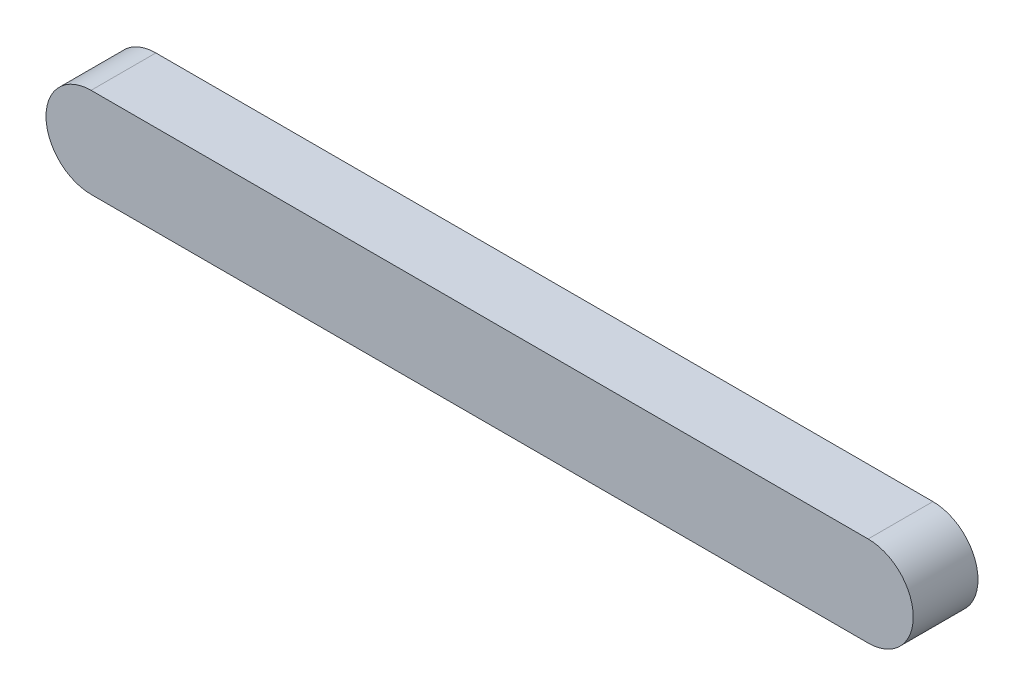
ISO-10303-21;
HEADER;
FILE_DESCRIPTION(('STEP AP214'),'2;1');
FILE_NAME('part.step','',(''),(''),'','','');
FILE_SCHEMA(('AUTOMOTIVE_DESIGN { 1 0 10303 214 1 1 1 1 }'));
ENDSEC;
DATA;
#1=APPLICATION_CONTEXT('core data for automotive mechanical design processes');
#2=APPLICATION_PROTOCOL_DEFINITION('international standard','automotive_design',2000,#1);
#3=PRODUCT_CONTEXT('',#1,'mechanical');
#4=PRODUCT('Part','Part','',(#3));
#5=PRODUCT_RELATED_PRODUCT_CATEGORY('part','',(#4));
#6=PRODUCT_DEFINITION_FORMATION('','',#4);
#7=PRODUCT_DEFINITION_CONTEXT('part definition',#1,'design');
#8=PRODUCT_DEFINITION('design','',#6,#7);
#9=PRODUCT_DEFINITION_SHAPE('','',#8);
#10=(LENGTH_UNIT() NAMED_UNIT(*) SI_UNIT(.MILLI.,.METRE.));
#11=(NAMED_UNIT(*) PLANE_ANGLE_UNIT() SI_UNIT($,.RADIAN.));
#12=(NAMED_UNIT(*) SI_UNIT($,.STERADIAN.) SOLID_ANGLE_UNIT());
#13=UNCERTAINTY_MEASURE_WITH_UNIT(LENGTH_MEASURE(1.E-05),#10,'distance_accuracy_value','');
#14=(GEOMETRIC_REPRESENTATION_CONTEXT(3) GLOBAL_UNCERTAINTY_ASSIGNED_CONTEXT((#13)) GLOBAL_UNIT_ASSIGNED_CONTEXT((#10,
#11,#12)) REPRESENTATION_CONTEXT('',''));
#15=CARTESIAN_POINT('',(0.,0.,0.));
#16=DIRECTION('',(0.,0.,1.));
#17=DIRECTION('',(1.,0.,0.));
#18=AXIS2_PLACEMENT_3D('',#15,#16,#17);
#19=CARTESIAN_POINT('',(0.,0.,10.));
#20=DIRECTION('',(0.,0.,-1.));
#21=DIRECTION('',(-1.,0.,0.));
#22=AXIS2_PLACEMENT_3D('',#19,#20,#21);
#23=CYLINDRICAL_SURFACE('',#22,6.96277578196803);
#24=CARTESIAN_POINT('',(0.,0.,0.));
#25=DIRECTION('',(0.,0.,1.));
#26=DIRECTION('',(1.,0.,0.));
#27=AXIS2_PLACEMENT_3D('',#24,#25,#26);
#28=CIRCLE('',#27,6.96277578196803);
#29=CARTESIAN_POINT('',(0.,6.96277578196803,0.));
#30=VERTEX_POINT('',#29);
#31=CARTESIAN_POINT('',(0.,-6.96277578196803,0.));
#32=VERTEX_POINT('',#31);
#33=EDGE_CURVE('E104',#30,#32,#28,.T.);
#34=ORIENTED_EDGE('',*,*,#33,.T.);
#35=DIRECTION('',(0.,0.,-1.));
#36=VECTOR('',#35,1.);
#37=CARTESIAN_POINT('',(0.,-6.96277578196803,10.));
#38=LINE('',#37,#36);
#39=CARTESIAN_POINT('',(0.,-6.96277578196803,10.));
#40=VERTEX_POINT('',#39);
#41=EDGE_CURVE('E11',#40,#32,#38,.T.);
#42=ORIENTED_EDGE('',*,*,#41,.F.);
#43=CARTESIAN_POINT('',(0.,0.,10.));
#44=DIRECTION('',(0.,0.,1.));
#45=DIRECTION('',(1.,0.,0.));
#46=AXIS2_PLACEMENT_3D('',#43,#44,#45);
#47=CIRCLE('',#46,6.96277578196803);
#48=CARTESIAN_POINT('',(0.,6.96277578196803,10.));
#49=VERTEX_POINT('',#48);
#50=EDGE_CURVE('E92',#49,#40,#47,.T.);
#51=ORIENTED_EDGE('',*,*,#50,.F.);
#52=DIRECTION('',(0.,0.,-1.));
#53=VECTOR('',#52,1.);
#54=CARTESIAN_POINT('',(0.,6.96277578196803,10.));
#55=LINE('',#54,#53);
#56=EDGE_CURVE('E100',#49,#30,#55,.T.);
#57=ORIENTED_EDGE('',*,*,#56,.T.);
#58=EDGE_LOOP('',(#34,#42,#51,#57));
#59=FACE_BOUND('',#58,.T.);
#60=ADVANCED_FACE('F41',(#59),#23,.T.);
#61=CARTESIAN_POINT('',(0.,-6.96277578196803,10.));
#62=DIRECTION('',(0.,1.,0.));
#63=DIRECTION('',(-1.,0.,0.));
#64=AXIS2_PLACEMENT_3D('',#61,#62,#63);
#65=PLANE('',#64);
#66=DIRECTION('',(1.,0.,0.));
#67=VECTOR('',#66,1.);
#68=CARTESIAN_POINT('',(0.,-6.96277578196803,0.));
#69=LINE('',#68,#67);
#70=CARTESIAN_POINT('',(120.,-6.96277578196804,0.));
#71=VERTEX_POINT('',#70);
#72=EDGE_CURVE('E96',#32,#71,#69,.T.);
#73=ORIENTED_EDGE('',*,*,#72,.T.);
#74=DIRECTION('',(0.,0.,-1.));
#75=VECTOR('',#74,1.);
#76=CARTESIAN_POINT('',(120.,-6.96277578196804,10.));
#77=LINE('',#76,#75);
#78=CARTESIAN_POINT('',(120.,-6.96277578196804,10.));
#79=VERTEX_POINT('',#78);
#80=EDGE_CURVE('E49',#79,#71,#77,.T.);
#81=ORIENTED_EDGE('',*,*,#80,.F.);
#82=DIRECTION('',(1.,0.,0.));
#83=VECTOR('',#82,1.);
#84=CARTESIAN_POINT('',(0.,-6.96277578196803,10.));
#85=LINE('',#84,#83);
#86=EDGE_CURVE('E87',#40,#79,#85,.T.);
#87=ORIENTED_EDGE('',*,*,#86,.F.);
#88=ORIENTED_EDGE('',*,*,#41,.T.);
#89=EDGE_LOOP('',(#73,#81,#87,#88));
#90=FACE_BOUND('',#89,.T.);
#91=ADVANCED_FACE('F95',(#90),#65,.F.);
#92=CARTESIAN_POINT('',(120.,0.,10.));
#93=DIRECTION('',(0.,0.,-1.));
#94=DIRECTION('',(-1.,0.,0.));
#95=AXIS2_PLACEMENT_3D('',#92,#93,#94);
#96=CYLINDRICAL_SURFACE('',#95,6.96277578196804);
#97=CARTESIAN_POINT('',(120.,0.,0.));
#98=DIRECTION('',(0.,0.,1.));
#99=DIRECTION('',(1.,0.,0.));
#100=AXIS2_PLACEMENT_3D('',#97,#98,#99);
#101=CIRCLE('',#100,6.96277578196804);
#102=CARTESIAN_POINT('',(120.,6.96277578196804,0.));
#103=VERTEX_POINT('',#102);
#104=EDGE_CURVE('E74',#71,#103,#101,.T.);
#105=ORIENTED_EDGE('',*,*,#104,.T.);
#106=DIRECTION('',(0.,0.,-1.));
#107=VECTOR('',#106,1.);
#108=CARTESIAN_POINT('',(120.,6.96277578196804,10.));
#109=LINE('',#108,#107);
#110=CARTESIAN_POINT('',(120.,6.96277578196804,10.));
#111=VERTEX_POINT('',#110);
#112=EDGE_CURVE('E97',#111,#103,#109,.T.);
#113=ORIENTED_EDGE('',*,*,#112,.F.);
#114=CARTESIAN_POINT('',(120.,0.,10.));
#115=DIRECTION('',(0.,0.,1.));
#116=DIRECTION('',(1.,0.,0.));
#117=AXIS2_PLACEMENT_3D('',#114,#115,#116);
#118=CIRCLE('',#117,6.96277578196804);
#119=EDGE_CURVE('E90',#79,#111,#118,.T.);
#120=ORIENTED_EDGE('',*,*,#119,.F.);
#121=ORIENTED_EDGE('',*,*,#80,.T.);
#122=EDGE_LOOP('',(#105,#113,#120,#121));
#123=FACE_BOUND('',#122,.T.);
#124=ADVANCED_FACE('F98',(#123),#96,.T.);
#125=CARTESIAN_POINT('',(0.,6.96277578196803,10.));
#126=DIRECTION('',(0.,-1.,0.));
#127=DIRECTION('',(1.,0.,0.));
#128=AXIS2_PLACEMENT_3D('',#125,#126,#127);
#129=PLANE('',#128);
#130=DIRECTION('',(-1.,0.,0.));
#131=VECTOR('',#130,1.);
#132=CARTESIAN_POINT('',(0.,6.96277578196803,0.));
#133=LINE('',#132,#131);
#134=EDGE_CURVE('E80',#103,#30,#133,.T.);
#135=ORIENTED_EDGE('',*,*,#134,.T.);
#136=ORIENTED_EDGE('',*,*,#56,.F.);
#137=DIRECTION('',(-1.,0.,0.));
#138=VECTOR('',#137,1.);
#139=CARTESIAN_POINT('',(0.,6.96277578196803,10.));
#140=LINE('',#139,#138);
#141=EDGE_CURVE('E57',#111,#49,#140,.T.);
#142=ORIENTED_EDGE('',*,*,#141,.F.);
#143=ORIENTED_EDGE('',*,*,#112,.T.);
#144=EDGE_LOOP('',(#135,#136,#142,#143));
#145=FACE_BOUND('',#144,.T.);
#146=ADVANCED_FACE('F111',(#145),#129,.F.);
#147=CARTESIAN_POINT('',(0.,0.,10.));
#148=DIRECTION('',(0.,0.,1.));
#149=DIRECTION('',(1.,0.,0.));
#150=AXIS2_PLACEMENT_3D('',#147,#148,#149);
#151=PLANE('',#150);
#152=ORIENTED_EDGE('',*,*,#50,.T.);
#153=ORIENTED_EDGE('',*,*,#86,.T.);
#154=ORIENTED_EDGE('',*,*,#119,.T.);
#155=ORIENTED_EDGE('',*,*,#141,.T.);
#156=EDGE_LOOP('',(#152,#153,#154,#155));
#157=FACE_BOUND('',#156,.T.);
#158=ADVANCED_FACE('F88',(#157),#151,.T.);
#159=CARTESIAN_POINT('',(0.,0.,0.));
#160=DIRECTION('',(0.,0.,1.));
#161=DIRECTION('',(1.,0.,0.));
#162=AXIS2_PLACEMENT_3D('',#159,#160,#161);
#163=PLANE('',#162);
#164=ORIENTED_EDGE('',*,*,#33,.F.);
#165=ORIENTED_EDGE('',*,*,#134,.F.);
#166=ORIENTED_EDGE('',*,*,#104,.F.);
#167=ORIENTED_EDGE('',*,*,#72,.F.);
#168=EDGE_LOOP('',(#164,#165,#166,#167));
#169=FACE_BOUND('',#168,.T.);
#170=ADVANCED_FACE('F114',(#169),#163,.F.);
#171=CLOSED_SHELL('',(#60,#91,#124,#146,#158,#170));
#172=MANIFOLD_SOLID_BREP('B2',#171);
#173=ADVANCED_BREP_SHAPE_REPRESENTATION('',(#18,#172),#14);
#174=SHAPE_DEFINITION_REPRESENTATION(#9,#173);
ENDSEC;
END-ISO-10303-21;
